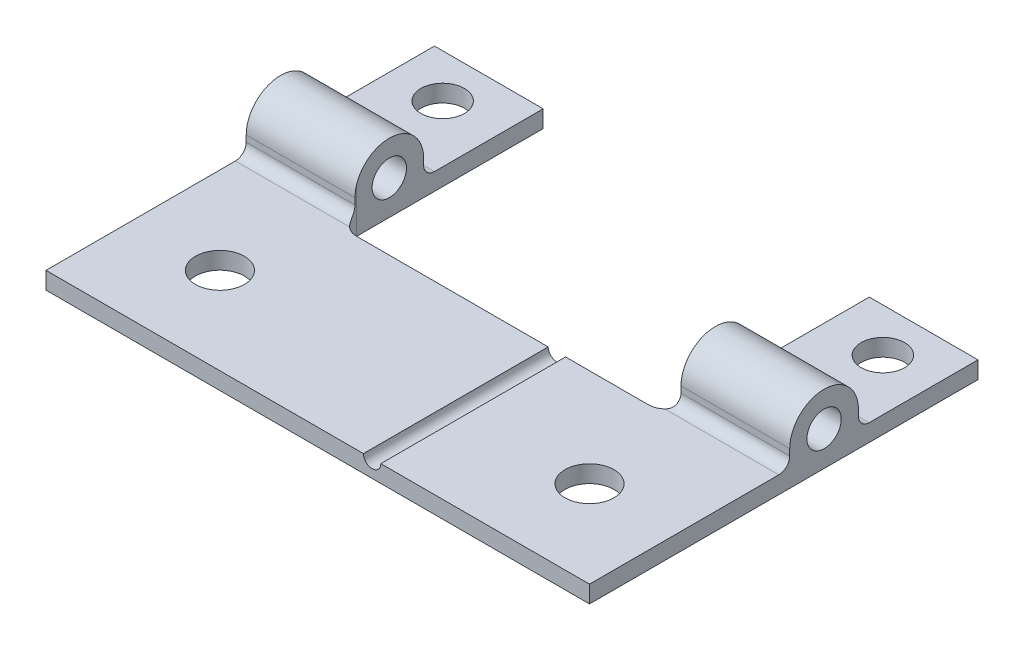
ISO-10303-21;
HEADER;
FILE_DESCRIPTION(('STEP AP214'),'2;1');
FILE_NAME('part.step','',(''),(''),'','','');
FILE_SCHEMA(('AUTOMOTIVE_DESIGN { 1 0 10303 214 1 1 1 1 }'));
ENDSEC;
DATA;
#1=APPLICATION_CONTEXT('core data for automotive mechanical design processes');
#2=APPLICATION_PROTOCOL_DEFINITION('international standard','automotive_design',2000,#1);
#3=PRODUCT_CONTEXT('',#1,'mechanical');
#4=PRODUCT('Part','Part','',(#3));
#5=PRODUCT_RELATED_PRODUCT_CATEGORY('part','',(#4));
#6=PRODUCT_DEFINITION_FORMATION('','',#4);
#7=PRODUCT_DEFINITION_CONTEXT('part definition',#1,'design');
#8=PRODUCT_DEFINITION('design','',#6,#7);
#9=PRODUCT_DEFINITION_SHAPE('','',#8);
#10=(LENGTH_UNIT() NAMED_UNIT(*) SI_UNIT(.MILLI.,.METRE.));
#11=(NAMED_UNIT(*) PLANE_ANGLE_UNIT() SI_UNIT($,.RADIAN.));
#12=(NAMED_UNIT(*) SI_UNIT($,.STERADIAN.) SOLID_ANGLE_UNIT());
#13=UNCERTAINTY_MEASURE_WITH_UNIT(LENGTH_MEASURE(1.E-05),#10,'distance_accuracy_value','');
#14=(GEOMETRIC_REPRESENTATION_CONTEXT(3) GLOBAL_UNCERTAINTY_ASSIGNED_CONTEXT((#13)) GLOBAL_UNIT_ASSIGNED_CONTEXT((#10,
#11,#12)) REPRESENTATION_CONTEXT('',''));
#15=CARTESIAN_POINT('',(0.,0.,0.));
#16=DIRECTION('',(0.,0.,1.));
#17=DIRECTION('',(1.,0.,0.));
#18=AXIS2_PLACEMENT_3D('',#15,#16,#17);
#19=CARTESIAN_POINT('',(0.,0.79,0.));
#20=DIRECTION('',(0.,-1.,0.));
#21=DIRECTION('',(0.,0.,-1.));
#22=AXIS2_PLACEMENT_3D('',#19,#20,#21);
#23=PLANE('',#22);
#24=CARTESIAN_POINT('',(9.8231981981982,0.79,-2.24887387387387));
#25=DIRECTION('',(0.,1.,0.));
#26=DIRECTION('',(0.,0.,1.));
#27=AXIS2_PLACEMENT_3D('',#24,#25,#26);
#28=CIRCLE('',#27,1.125);
#29=CARTESIAN_POINT('',(9.8231981981982,0.79,-1.12387387387387));
#30=VERTEX_POINT('',#29);
#31=EDGE_CURVE('E394',#30,#30,#28,.T.);
#32=ORIENTED_EDGE('',*,*,#31,.F.);
#33=EDGE_LOOP('',(#32));
#34=FACE_BOUND('',#33,.T.);
#35=DIRECTION('',(1.,0.,0.));
#36=VECTOR('',#35,1.);
#37=CARTESIAN_POINT('',(3.8231981981982,0.79,-6.74887387387387));
#38=LINE('',#37,#36);
#39=CARTESIAN_POINT('',(4.2231981981982,0.79,-6.74887387387387));
#40=VERTEX_POINT('',#39);
#41=CARTESIAN_POINT('',(8.03319819819819,0.79,-6.74887387387387));
#42=VERTEX_POINT('',#41);
#43=EDGE_CURVE('E396',#40,#42,#38,.T.);
#44=ORIENTED_EDGE('',*,*,#43,.F.);
#45=DIRECTION('',(0.,0.,1.));
#46=VECTOR('',#45,1.);
#47=CARTESIAN_POINT('',(4.2231981981982,0.79,-8.24887387387387));
#48=LINE('',#47,#46);
#49=CARTESIAN_POINT('',(4.2231981981982,0.79,1.75112612612613));
#50=VERTEX_POINT('',#49);
#51=EDGE_CURVE('E57',#40,#50,#48,.T.);
#52=ORIENTED_EDGE('',*,*,#51,.T.);
#53=DIRECTION('',(1.,0.,0.));
#54=VECTOR('',#53,1.);
#55=CARTESIAN_POINT('',(-11.1768018018018,0.79,1.75112612612613));
#56=LINE('',#55,#54);
#57=CARTESIAN_POINT('',(13.8231981981982,0.79,1.75112612612613));
#58=VERTEX_POINT('',#57);
#59=EDGE_CURVE('E220',#50,#58,#56,.T.);
#60=ORIENTED_EDGE('',*,*,#59,.T.);
#61=DIRECTION('',(0.,0.,-1.));
#62=VECTOR('',#61,1.);
#63=CARTESIAN_POINT('',(13.8231981981982,0.79,1.75112612612613));
#64=LINE('',#63,#62);
#65=CARTESIAN_POINT('',(13.8231981981982,0.79,-6.95887387387388));
#66=VERTEX_POINT('',#65);
#67=EDGE_CURVE('E228',#58,#66,#64,.T.);
#68=ORIENTED_EDGE('',*,*,#67,.T.);
#69=DIRECTION('',(1.,0.,0.));
#70=VECTOR('',#69,1.);
#71=CARTESIAN_POINT('',(0.,0.79,-6.95887387387387));
#72=LINE('',#71,#70);
#73=CARTESIAN_POINT('',(8.56957493147435,0.79,-6.95887387387388));
#74=VERTEX_POINT('',#73);
#75=EDGE_CURVE('E64',#66,#74,#72,.F.);
#76=ORIENTED_EDGE('',*,*,#75,.T.);
#77=CARTESIAN_POINT('',(8.03319819819819,0.79,-7.53887387387387));
#78=DIRECTION('',(0.,-1.,0.));
#79=DIRECTION('',(0.,0.,-1.));
#80=AXIS2_PLACEMENT_3D('',#77,#78,#79);
#81=CIRCLE('',#80,0.79);
#82=EDGE_CURVE('E50',#74,#42,#81,.T.);
#83=ORIENTED_EDGE('',*,*,#82,.T.);
#84=EDGE_LOOP('',(#44,#52,#60,#68,#76,#83));
#85=FACE_BOUND('',#84,.T.);
#86=ADVANCED_FACE('F40',(#34,#85),#23,.F.);
#87=CARTESIAN_POINT('',(-7.1768018018018,0.79,-2.24887387387387));
#88=DIRECTION('',(0.,1.,0.));
#89=DIRECTION('',(0.,0.,1.));
#90=AXIS2_PLACEMENT_3D('',#87,#88,#89);
#91=CIRCLE('',#90,1.125);
#92=CARTESIAN_POINT('',(-7.1768018018018,0.79,-1.12387387387387));
#93=VERTEX_POINT('',#92);
#94=EDGE_CURVE('E266',#93,#93,#91,.T.);
#95=ORIENTED_EDGE('',*,*,#94,.F.);
#96=EDGE_LOOP('',(#95));
#97=FACE_BOUND('',#96,.T.);
#98=CARTESIAN_POINT('',(-11.1768018018018,0.79,1.75112612612613));
#99=VERTEX_POINT('',#98);
#100=CARTESIAN_POINT('',(3.4231981981982,0.79,1.75112612612613));
#101=VERTEX_POINT('',#100);
#102=EDGE_CURVE('E217',#99,#101,#56,.T.);
#103=ORIENTED_EDGE('',*,*,#102,.T.);
#104=DIRECTION('',(0.,0.,1.));
#105=VECTOR('',#104,1.);
#106=CARTESIAN_POINT('',(3.4231981981982,0.79,-8.24887387387387));
#107=LINE('',#106,#105);
#108=CARTESIAN_POINT('',(3.4231981981982,0.79,-6.74887387387387));
#109=VERTEX_POINT('',#108);
#110=EDGE_CURVE('E202',#101,#109,#107,.F.);
#111=ORIENTED_EDGE('',*,*,#110,.T.);
#112=CARTESIAN_POINT('',(-5.3868018018018,0.79,-6.74887387387387));
#113=VERTEX_POINT('',#112);
#114=EDGE_CURVE('E401',#113,#109,#38,.T.);
#115=ORIENTED_EDGE('',*,*,#114,.F.);
#116=CARTESIAN_POINT('',(-5.3868018018018,0.79,-7.53887387387387));
#117=DIRECTION('',(0.,-1.,0.));
#118=DIRECTION('',(0.,0.,-1.));
#119=AXIS2_PLACEMENT_3D('',#116,#117,#118);
#120=CIRCLE('',#119,0.79);
#121=CARTESIAN_POINT('',(-5.92317853507796,0.79,-6.95887387387387));
#122=VERTEX_POINT('',#121);
#123=EDGE_CURVE('E307',#113,#122,#120,.T.);
#124=ORIENTED_EDGE('',*,*,#123,.T.);
#125=DIRECTION('',(-1.,0.,0.));
#126=VECTOR('',#125,1.);
#127=CARTESIAN_POINT('',(-11.1768018018018,0.79,-6.95887387387387));
#128=LINE('',#127,#126);
#129=CARTESIAN_POINT('',(-11.1768018018018,0.79,-6.95887387387387));
#130=VERTEX_POINT('',#129);
#131=EDGE_CURVE('E254',#122,#130,#128,.T.);
#132=ORIENTED_EDGE('',*,*,#131,.T.);
#133=DIRECTION('',(0.,0.,1.));
#134=VECTOR('',#133,1.);
#135=CARTESIAN_POINT('',(-11.1768018018018,0.79,1.75112612612613));
#136=LINE('',#135,#134);
#137=EDGE_CURVE('E226',#130,#99,#136,.T.);
#138=ORIENTED_EDGE('',*,*,#137,.T.);
#139=EDGE_LOOP('',(#103,#111,#115,#124,#132,#138));
#140=FACE_BOUND('',#139,.T.);
#141=ADVANCED_FACE('F223',(#97,#140),#23,.F.);
#142=CARTESIAN_POINT('',(-11.1768018018018,0.79,1.75112612612613));
#143=DIRECTION('',(1.,0.,0.));
#144=DIRECTION('',(0.,0.,-1.));
#145=AXIS2_PLACEMENT_3D('',#142,#143,#144);
#146=PLANE('',#145);
#147=CARTESIAN_POINT('',(-11.1768018018018,1.58,-9.03887387387387));
#148=DIRECTION('',(-1.,0.,0.));
#149=DIRECTION('',(0.,0.,1.));
#150=AXIS2_PLACEMENT_3D('',#147,#148,#149);
#151=CIRCLE('',#150,0.789999999999999);
#152=CARTESIAN_POINT('',(-11.1768018018018,1.58,-8.24887387387387));
#153=VERTEX_POINT('',#152);
#154=EDGE_CURVE('E260',#153,#153,#151,.T.);
#155=ORIENTED_EDGE('',*,*,#154,.F.);
#156=EDGE_LOOP('',(#155));
#157=FACE_BOUND('',#156,.T.);
#158=DIRECTION('',(0.,-1.,0.));
#159=VECTOR('',#158,1.);
#160=CARTESIAN_POINT('',(-11.1768018018018,0.,-16.1188738738739));
#161=LINE('',#160,#159);
#162=CARTESIAN_POINT('',(-11.1768018018018,0.790000000000035,-16.1188738738739));
#163=VERTEX_POINT('',#162);
#164=CARTESIAN_POINT('',(-11.1768018018018,0.,-16.1188738738739));
#165=VERTEX_POINT('',#164);
#166=EDGE_CURVE('E530',#163,#165,#161,.T.);
#167=ORIENTED_EDGE('',*,*,#166,.T.);
#168=DIRECTION('',(0.,0.,1.));
#169=VECTOR('',#168,1.);
#170=CARTESIAN_POINT('',(-11.1768018018018,0.,1.75112612612613));
#171=LINE('',#170,#169);
#172=CARTESIAN_POINT('',(-11.1768018018018,0.,1.75112612612613));
#173=VERTEX_POINT('',#172);
#174=EDGE_CURVE('E237',#165,#173,#171,.T.);
#175=ORIENTED_EDGE('',*,*,#174,.T.);
#176=DIRECTION('',(0.,-1.,0.));
#177=VECTOR('',#176,1.);
#178=CARTESIAN_POINT('',(-11.1768018018018,0.79,1.75112612612613));
#179=LINE('',#178,#177);
#180=EDGE_CURVE('E251',#99,#173,#179,.T.);
#181=ORIENTED_EDGE('',*,*,#180,.F.);
#182=ORIENTED_EDGE('',*,*,#137,.F.);
#183=CARTESIAN_POINT('',(-11.1768018018018,1.29,-6.95887387387387));
#184=DIRECTION('',(1.,0.,0.));
#185=DIRECTION('',(0.,0.,-1.));
#186=AXIS2_PLACEMENT_3D('',#183,#184,#185);
#187=CIRCLE('',#186,0.5);
#188=CARTESIAN_POINT('',(-11.1768018018018,1.29,-7.45887387387387));
#189=VERTEX_POINT('',#188);
#190=EDGE_CURVE('E275',#130,#189,#187,.T.);
#191=ORIENTED_EDGE('',*,*,#190,.T.);
#192=DIRECTION('',(0.,-1.,0.));
#193=VECTOR('',#192,1.);
#194=CARTESIAN_POINT('',(-11.1768018018018,0.,-7.45887387387387));
#195=LINE('',#194,#193);
#196=CARTESIAN_POINT('',(-11.1768018018018,1.58,-7.45887387387387));
#197=VERTEX_POINT('',#196);
#198=EDGE_CURVE('E534',#197,#189,#195,.T.);
#199=ORIENTED_EDGE('',*,*,#198,.F.);
#200=CARTESIAN_POINT('',(-11.1768018018018,1.58,-9.03887387387387));
#201=DIRECTION('',(-1.,0.,0.));
#202=DIRECTION('',(0.,0.,1.));
#203=AXIS2_PLACEMENT_3D('',#200,#201,#202);
#204=CIRCLE('',#203,1.58);
#205=CARTESIAN_POINT('',(-11.1768018018018,1.57999999999999,-10.6188738738739));
#206=VERTEX_POINT('',#205);
#207=EDGE_CURVE('E538',#197,#206,#204,.T.);
#208=ORIENTED_EDGE('',*,*,#207,.T.);
#209=DIRECTION('',(0.,-1.,0.));
#210=VECTOR('',#209,1.);
#211=CARTESIAN_POINT('',(-11.1768018018018,0.,-10.6188738738739));
#212=LINE('',#211,#210);
#213=CARTESIAN_POINT('',(-11.1768018018018,1.29,-10.6188738738739));
#214=VERTEX_POINT('',#213);
#215=EDGE_CURVE('E504',#206,#214,#212,.T.);
#216=ORIENTED_EDGE('',*,*,#215,.T.);
#217=CARTESIAN_POINT('',(-11.1768018018018,1.29,-11.1188738738739));
#218=DIRECTION('',(-1.,0.,0.));
#219=DIRECTION('',(0.,0.,1.));
#220=AXIS2_PLACEMENT_3D('',#217,#218,#219);
#221=CIRCLE('',#220,0.499999999999997);
#222=CARTESIAN_POINT('',(-11.1768018018018,0.790000000000003,-11.1188738738739));
#223=VERTEX_POINT('',#222);
#224=EDGE_CURVE('E259',#223,#214,#221,.T.);
#225=ORIENTED_EDGE('',*,*,#224,.F.);
#226=DIRECTION('',(0.,0.,-1.));
#227=VECTOR('',#226,1.);
#228=CARTESIAN_POINT('',(-11.1768018018018,0.789999999999932,0.));
#229=LINE('',#228,#227);
#230=EDGE_CURVE('E526',#223,#163,#229,.T.);
#231=ORIENTED_EDGE('',*,*,#230,.T.);
#232=EDGE_LOOP('',(#167,#175,#181,#182,#191,#199,#208,#216,#225,#231));
#233=FACE_BOUND('',#232,.T.);
#234=ADVANCED_FACE('F372',(#157,#233),#146,.F.);
#235=CARTESIAN_POINT('',(-11.1768018018018,0.79,1.75112612612613));
#236=DIRECTION('',(0.,0.,-1.));
#237=DIRECTION('',(-1.,0.,0.));
#238=AXIS2_PLACEMENT_3D('',#235,#236,#237);
#239=PLANE('',#238);
#240=ORIENTED_EDGE('',*,*,#59,.F.);
#241=CARTESIAN_POINT('',(3.8231981981982,0.79,1.75112612612613));
#242=DIRECTION('',(0.,0.,-1.));
#243=DIRECTION('',(-1.,0.,0.));
#244=AXIS2_PLACEMENT_3D('',#241,#242,#243);
#245=CIRCLE('',#244,0.4);
#246=EDGE_CURVE('E205',#101,#50,#245,.F.);
#247=ORIENTED_EDGE('',*,*,#246,.F.);
#248=ORIENTED_EDGE('',*,*,#102,.F.);
#249=ORIENTED_EDGE('',*,*,#180,.T.);
#250=DIRECTION('',(1.,0.,0.));
#251=VECTOR('',#250,1.);
#252=CARTESIAN_POINT('',(-11.1768018018018,0.,1.75112612612613));
#253=LINE('',#252,#251);
#254=CARTESIAN_POINT('',(13.8231981981982,0.,1.75112612612613));
#255=VERTEX_POINT('',#254);
#256=EDGE_CURVE('E241',#173,#255,#253,.T.);
#257=ORIENTED_EDGE('',*,*,#256,.T.);
#258=DIRECTION('',(0.,-1.,0.));
#259=VECTOR('',#258,1.);
#260=CARTESIAN_POINT('',(13.8231981981982,0.79,1.75112612612613));
#261=LINE('',#260,#259);
#262=EDGE_CURVE('E232',#58,#255,#261,.T.);
#263=ORIENTED_EDGE('',*,*,#262,.F.);
#264=EDGE_LOOP('',(#240,#247,#248,#249,#257,#263));
#265=FACE_BOUND('',#264,.T.);
#266=ADVANCED_FACE('F215',(#265),#239,.F.);
#267=CARTESIAN_POINT('',(13.8231981981982,0.79,1.75112612612613));
#268=DIRECTION('',(-1.,0.,0.));
#269=DIRECTION('',(0.,0.,1.));
#270=AXIS2_PLACEMENT_3D('',#267,#268,#269);
#271=PLANE('',#270);
#272=CARTESIAN_POINT('',(13.8231981981982,1.58,-9.03887387387388));
#273=DIRECTION('',(-1.,0.,0.));
#274=DIRECTION('',(0.,0.,1.));
#275=AXIS2_PLACEMENT_3D('',#272,#273,#274);
#276=CIRCLE('',#275,0.789999999999999);
#277=CARTESIAN_POINT('',(13.8231981981982,1.58,-8.24887387387388));
#278=VERTEX_POINT('',#277);
#279=EDGE_CURVE('E284',#278,#278,#276,.T.);
#280=ORIENTED_EDGE('',*,*,#279,.T.);
#281=EDGE_LOOP('',(#280));
#282=FACE_BOUND('',#281,.T.);
#283=DIRECTION('',(0.,0.,-1.));
#284=VECTOR('',#283,1.);
#285=CARTESIAN_POINT('',(13.8231981981982,0.,1.75112612612613));
#286=LINE('',#285,#284);
#287=CARTESIAN_POINT('',(13.8231981981982,0.,-16.1188738738739));
#288=VERTEX_POINT('',#287);
#289=EDGE_CURVE('E245',#255,#288,#286,.T.);
#290=ORIENTED_EDGE('',*,*,#289,.T.);
#291=DIRECTION('',(0.,-1.,0.));
#292=VECTOR('',#291,1.);
#293=CARTESIAN_POINT('',(13.8231981981982,0.,-16.1188738738739));
#294=LINE('',#293,#292);
#295=CARTESIAN_POINT('',(13.8231981981982,0.790000000000035,-16.1188738738739));
#296=VERTEX_POINT('',#295);
#297=EDGE_CURVE('E458',#296,#288,#294,.T.);
#298=ORIENTED_EDGE('',*,*,#297,.F.);
#299=DIRECTION('',(0.,0.,-1.));
#300=VECTOR('',#299,1.);
#301=CARTESIAN_POINT('',(13.8231981981982,0.789999999999932,0.));
#302=LINE('',#301,#300);
#303=CARTESIAN_POINT('',(13.8231981981982,0.790000000000003,-11.1188738738739));
#304=VERTEX_POINT('',#303);
#305=EDGE_CURVE('E427',#304,#296,#302,.T.);
#306=ORIENTED_EDGE('',*,*,#305,.F.);
#307=CARTESIAN_POINT('',(13.8231981981982,1.29,-11.1188738738739));
#308=DIRECTION('',(-1.,0.,0.));
#309=DIRECTION('',(0.,0.,1.));
#310=AXIS2_PLACEMENT_3D('',#307,#308,#309);
#311=CIRCLE('',#310,0.499999999999997);
#312=CARTESIAN_POINT('',(13.8231981981982,1.29,-10.6188738738739));
#313=VERTEX_POINT('',#312);
#314=EDGE_CURVE('E283',#304,#313,#311,.T.);
#315=ORIENTED_EDGE('',*,*,#314,.T.);
#316=DIRECTION('',(0.,-1.,0.));
#317=VECTOR('',#316,1.);
#318=CARTESIAN_POINT('',(13.8231981981982,0.,-10.6188738738739));
#319=LINE('',#318,#317);
#320=CARTESIAN_POINT('',(13.8231981981982,1.57999999999999,-10.6188738738739));
#321=VERTEX_POINT('',#320);
#322=EDGE_CURVE('E447',#321,#313,#319,.T.);
#323=ORIENTED_EDGE('',*,*,#322,.F.);
#324=CARTESIAN_POINT('',(13.8231981981982,1.58,-9.03887387387388));
#325=DIRECTION('',(-1.,0.,0.));
#326=DIRECTION('',(0.,0.,1.));
#327=AXIS2_PLACEMENT_3D('',#324,#325,#326);
#328=CIRCLE('',#327,1.58);
#329=CARTESIAN_POINT('',(13.8231981981982,1.58,-7.45887387387388));
#330=VERTEX_POINT('',#329);
#331=EDGE_CURVE('E451',#330,#321,#328,.T.);
#332=ORIENTED_EDGE('',*,*,#331,.F.);
#333=DIRECTION('',(0.,-1.,0.));
#334=VECTOR('',#333,1.);
#335=CARTESIAN_POINT('',(13.8231981981982,0.,-7.45887387387388));
#336=LINE('',#335,#334);
#337=CARTESIAN_POINT('',(13.8231981981982,1.29,-7.45887387387388));
#338=VERTEX_POINT('',#337);
#339=EDGE_CURVE('E454',#330,#338,#336,.T.);
#340=ORIENTED_EDGE('',*,*,#339,.T.);
#341=CARTESIAN_POINT('',(13.8231981981982,1.29,-6.95887387387388));
#342=DIRECTION('',(-1.,0.,0.));
#343=DIRECTION('',(0.,0.,1.));
#344=AXIS2_PLACEMENT_3D('',#341,#342,#343);
#345=CIRCLE('',#344,0.5);
#346=EDGE_CURVE('E290',#338,#66,#345,.T.);
#347=ORIENTED_EDGE('',*,*,#346,.T.);
#348=ORIENTED_EDGE('',*,*,#67,.F.);
#349=ORIENTED_EDGE('',*,*,#262,.T.);
#350=EDGE_LOOP('',(#290,#298,#306,#315,#323,#332,#340,#347,#348,#349));
#351=FACE_BOUND('',#350,.T.);
#352=ADVANCED_FACE('F376',(#282,#351),#271,.F.);
#353=CARTESIAN_POINT('',(0.,0.,0.));
#354=DIRECTION('',(0.,-1.,0.));
#355=DIRECTION('',(0.,0.,-1.));
#356=AXIS2_PLACEMENT_3D('',#353,#354,#355);
#357=PLANE('',#356);
#358=DIRECTION('',(0.,0.,-1.));
#359=VECTOR('',#358,1.);
#360=CARTESIAN_POINT('',(-6.1768018018018,0.,0.));
#361=LINE('',#360,#359);
#362=CARTESIAN_POINT('',(-6.1768018018018,0.,-7.53887387387387));
#363=VERTEX_POINT('',#362);
#364=CARTESIAN_POINT('',(-6.1768018018018,0.,-16.1188738738739));
#365=VERTEX_POINT('',#364);
#366=EDGE_CURVE('E512',#363,#365,#361,.T.);
#367=ORIENTED_EDGE('',*,*,#366,.F.);
#368=CARTESIAN_POINT('',(-5.3868018018018,0.,-7.53887387387387));
#369=DIRECTION('',(0.,-1.,0.));
#370=DIRECTION('',(0.,0.,-1.));
#371=AXIS2_PLACEMENT_3D('',#368,#369,#370);
#372=CIRCLE('',#371,0.79);
#373=CARTESIAN_POINT('',(-5.3868018018018,0.,-6.74887387387387));
#374=VERTEX_POINT('',#373);
#375=EDGE_CURVE('E342',#363,#374,#372,.F.);
#376=ORIENTED_EDGE('',*,*,#375,.T.);
#377=DIRECTION('',(-1.,0.,0.));
#378=VECTOR('',#377,1.);
#379=CARTESIAN_POINT('',(3.8231981981982,0.,-6.74887387387387));
#380=LINE('',#379,#378);
#381=CARTESIAN_POINT('',(8.03319819819819,0.,-6.74887387387387));
#382=VERTEX_POINT('',#381);
#383=EDGE_CURVE('E405',#382,#374,#380,.T.);
#384=ORIENTED_EDGE('',*,*,#383,.F.);
#385=CARTESIAN_POINT('',(8.03319819819819,0.,-7.53887387387387));
#386=DIRECTION('',(0.,-1.,0.));
#387=DIRECTION('',(0.,0.,-1.));
#388=AXIS2_PLACEMENT_3D('',#385,#386,#387);
#389=CIRCLE('',#388,0.79);
#390=CARTESIAN_POINT('',(8.8231981981982,0.,-7.53887387387387));
#391=VERTEX_POINT('',#390);
#392=EDGE_CURVE('E602',#382,#391,#389,.F.);
#393=ORIENTED_EDGE('',*,*,#392,.T.);
#394=DIRECTION('',(0.,0.,-1.));
#395=VECTOR('',#394,1.);
#396=CARTESIAN_POINT('',(8.8231981981982,0.,0.));
#397=LINE('',#396,#395);
#398=CARTESIAN_POINT('',(8.82319819819819,0.,-16.1188738738739));
#399=VERTEX_POINT('',#398);
#400=EDGE_CURVE('E433',#391,#399,#397,.T.);
#401=ORIENTED_EDGE('',*,*,#400,.T.);
#402=DIRECTION('',(1.,0.,0.));
#403=VECTOR('',#402,1.);
#404=CARTESIAN_POINT('',(8.82319819819819,0.,-16.1188738738739));
#405=LINE('',#404,#403);
#406=EDGE_CURVE('E472',#399,#288,#405,.T.);
#407=ORIENTED_EDGE('',*,*,#406,.T.);
#408=ORIENTED_EDGE('',*,*,#289,.F.);
#409=ORIENTED_EDGE('',*,*,#256,.F.);
#410=ORIENTED_EDGE('',*,*,#174,.F.);
#411=DIRECTION('',(-1.,0.,0.));
#412=VECTOR('',#411,1.);
#413=CARTESIAN_POINT('',(-6.1768018018018,0.,-16.1188738738739));
#414=LINE('',#413,#412);
#415=EDGE_CURVE('E553',#365,#165,#414,.T.);
#416=ORIENTED_EDGE('',*,*,#415,.F.);
#417=EDGE_LOOP('',(#367,#376,#384,#393,#401,#407,#408,#409,#410,#416));
#418=FACE_BOUND('',#417,.T.);
#419=CARTESIAN_POINT('',(11.4481981981982,0.,-14.1188738738739));
#420=DIRECTION('',(0.,-1.,0.));
#421=DIRECTION('',(0.,0.,-1.));
#422=AXIS2_PLACEMENT_3D('',#419,#420,#421);
#423=CIRCLE('',#422,1.);
#424=CARTESIAN_POINT('',(11.4481981981982,0.,-15.1188738738739));
#425=VERTEX_POINT('',#424);
#426=EDGE_CURVE('E415',#425,#425,#423,.F.);
#427=ORIENTED_EDGE('',*,*,#426,.T.);
#428=EDGE_LOOP('',(#427));
#429=FACE_BOUND('',#428,.T.);
#430=CARTESIAN_POINT('',(-8.8018018018018,0.,-14.1188738738739));
#431=DIRECTION('',(0.,-1.,0.));
#432=DIRECTION('',(0.,0.,-1.));
#433=AXIS2_PLACEMENT_3D('',#430,#431,#432);
#434=CIRCLE('',#433,1.);
#435=CARTESIAN_POINT('',(-8.8018018018018,0.,-15.1188738738739));
#436=VERTEX_POINT('',#435);
#437=EDGE_CURVE('E488',#436,#436,#434,.T.);
#438=ORIENTED_EDGE('',*,*,#437,.F.);
#439=EDGE_LOOP('',(#438));
#440=FACE_BOUND('',#439,.T.);
#441=CARTESIAN_POINT('',(-7.1768018018018,0.,-2.24887387387387));
#442=DIRECTION('',(0.,-1.,0.));
#443=DIRECTION('',(0.,0.,-1.));
#444=AXIS2_PLACEMENT_3D('',#441,#442,#443);
#445=CIRCLE('',#444,1.125);
#446=CARTESIAN_POINT('',(-7.1768018018018,0.,-3.37387387387387));
#447=VERTEX_POINT('',#446);
#448=EDGE_CURVE('E265',#447,#447,#445,.T.);
#449=ORIENTED_EDGE('',*,*,#448,.F.);
#450=EDGE_LOOP('',(#449));
#451=FACE_BOUND('',#450,.T.);
#452=CARTESIAN_POINT('',(9.8231981981982,0.,-2.24887387387387));
#453=DIRECTION('',(0.,-1.,0.));
#454=DIRECTION('',(0.,0.,-1.));
#455=AXIS2_PLACEMENT_3D('',#452,#453,#454);
#456=CIRCLE('',#455,1.125);
#457=CARTESIAN_POINT('',(9.8231981981982,0.,-3.37387387387387));
#458=VERTEX_POINT('',#457);
#459=EDGE_CURVE('E261',#458,#458,#456,.T.);
#460=ORIENTED_EDGE('',*,*,#459,.F.);
#461=EDGE_LOOP('',(#460));
#462=FACE_BOUND('',#461,.T.);
#463=ADVANCED_FACE('F368',(#418,#429,#440,#451,#462),#357,.T.);
#464=CARTESIAN_POINT('',(-6.1768018018018,1.29,-11.1188738738739));
#465=DIRECTION('',(-1.,0.,0.));
#466=DIRECTION('',(0.,0.,1.));
#467=AXIS2_PLACEMENT_3D('',#464,#465,#466);
#468=CYLINDRICAL_SURFACE('',#467,0.499999999999997);
#469=ORIENTED_EDGE('',*,*,#224,.T.);
#470=DIRECTION('',(-1.,0.,0.));
#471=VECTOR('',#470,1.);
#472=CARTESIAN_POINT('',(-6.1768018018018,1.29,-10.6188738738739));
#473=LINE('',#472,#471);
#474=CARTESIAN_POINT('',(-6.1768018018018,1.29,-10.6188738738739));
#475=VERTEX_POINT('',#474);
#476=EDGE_CURVE('E242',#475,#214,#473,.T.);
#477=ORIENTED_EDGE('',*,*,#476,.F.);
#478=CARTESIAN_POINT('',(-6.1768018018018,1.29,-11.1188738738739));
#479=DIRECTION('',(-1.,0.,0.));
#480=DIRECTION('',(0.,0.,1.));
#481=AXIS2_PLACEMENT_3D('',#478,#479,#480);
#482=CIRCLE('',#481,0.499999999999997);
#483=CARTESIAN_POINT('',(-6.1768018018018,0.790000000000003,-11.1188738738739));
#484=VERTEX_POINT('',#483);
#485=EDGE_CURVE('E500',#484,#475,#482,.T.);
#486=ORIENTED_EDGE('',*,*,#485,.F.);
#487=DIRECTION('',(-1.,0.,0.));
#488=VECTOR('',#487,1.);
#489=CARTESIAN_POINT('',(-6.1768018018018,0.790000000000003,-11.1188738738739));
#490=LINE('',#489,#488);
#491=EDGE_CURVE('E522',#484,#223,#490,.T.);
#492=ORIENTED_EDGE('',*,*,#491,.T.);
#493=EDGE_LOOP('',(#469,#477,#486,#492));
#494=FACE_BOUND('',#493,.T.);
#495=ADVANCED_FACE('F365',(#494),#468,.F.);
#496=CARTESIAN_POINT('',(-6.1768018018018,0.,-10.6188738738739));
#497=DIRECTION('',(0.,0.,-1.));
#498=DIRECTION('',(-1.,0.,0.));
#499=AXIS2_PLACEMENT_3D('',#496,#497,#498);
#500=PLANE('',#499);
#501=ORIENTED_EDGE('',*,*,#215,.F.);
#502=DIRECTION('',(-1.,0.,0.));
#503=VECTOR('',#502,1.);
#504=CARTESIAN_POINT('',(-6.1768018018018,1.57999999999999,-10.6188738738739));
#505=LINE('',#504,#503);
#506=CARTESIAN_POINT('',(-6.1768018018018,1.57999999999999,-10.6188738738739));
#507=VERTEX_POINT('',#506);
#508=EDGE_CURVE('E547',#507,#206,#505,.T.);
#509=ORIENTED_EDGE('',*,*,#508,.F.);
#510=DIRECTION('',(0.,-1.,0.));
#511=VECTOR('',#510,1.);
#512=CARTESIAN_POINT('',(-6.1768018018018,0.,-10.6188738738739));
#513=LINE('',#512,#511);
#514=EDGE_CURVE('E518',#507,#475,#513,.T.);
#515=ORIENTED_EDGE('',*,*,#514,.T.);
#516=ORIENTED_EDGE('',*,*,#476,.T.);
#517=EDGE_LOOP('',(#501,#509,#515,#516));
#518=FACE_BOUND('',#517,.T.);
#519=ADVANCED_FACE('F350',(#518),#500,.T.);
#520=CARTESIAN_POINT('',(-6.1768018018018,1.58,-9.03887387387387));
#521=DIRECTION('',(-1.,0.,0.));
#522=DIRECTION('',(0.,0.,1.));
#523=AXIS2_PLACEMENT_3D('',#520,#521,#522);
#524=CYLINDRICAL_SURFACE('',#523,1.58);
#525=ORIENTED_EDGE('',*,*,#207,.F.);
#526=DIRECTION('',(-1.,0.,0.));
#527=VECTOR('',#526,1.);
#528=CARTESIAN_POINT('',(-6.1768018018018,1.58,-7.45887387387387));
#529=LINE('',#528,#527);
#530=CARTESIAN_POINT('',(-6.17274073072695,1.58,-7.45887387387387));
#531=VERTEX_POINT('',#530);
#532=EDGE_CURVE('E550',#531,#197,#529,.T.);
#533=ORIENTED_EDGE('',*,*,#532,.F.);
#534=CARTESIAN_POINT('',(-6.17274073072695,1.58,-7.45887387387387));
#535=CARTESIAN_POINT('',(-6.17271873165551,1.6222150890217,-7.45887029628348));
#536=CARTESIAN_POINT('',(-6.17291303288011,1.66442830245246,-7.46056573279213));
#537=CARTESIAN_POINT('',(-6.17356595624928,1.74831507615736,-7.46730568527939));
#538=CARTESIAN_POINT('',(-6.1740228940677,1.78999036105862,-7.47232889083007));
#539=CARTESIAN_POINT('',(-6.17503673304547,1.87280716422653,-7.48567613537766));
#540=CARTESIAN_POINT('',(-6.17559363297583,1.91394868904886,-7.49400013379422));
#541=CARTESIAN_POINT('',(-6.17646775862404,1.99570263312272,-7.51395560135701));
#542=CARTESIAN_POINT('',(-6.17678342999501,2.03630999111318,-7.52560786651287));
#543=CARTESIAN_POINT('',(-6.1768018018018,2.07638694583963,-7.53887387387387));
#544=B_SPLINE_CURVE_WITH_KNOTS('',3,(#534,#535,#536,#537,#538,#539,#540,#541,#542,#543),
.UNSPECIFIED.,.F.,.F.,(4,2,2,2,4),(0.,0.126607774181664,0.252412512691905,0.378215704591545,
0.504822824397376),.UNSPECIFIED.);
#545=CARTESIAN_POINT('',(-6.1768018018018,2.07638694583963,-7.53887387387387));
#546=VERTEX_POINT('',#545);
#547=EDGE_CURVE('E334',#531,#546,#544,.T.);
#548=ORIENTED_EDGE('',*,*,#547,.T.);
#549=CARTESIAN_POINT('',(-6.1768018018018,1.58,-9.03887387387387));
#550=DIRECTION('',(-1.,0.,0.));
#551=DIRECTION('',(0.,0.,1.));
#552=AXIS2_PLACEMENT_3D('',#549,#550,#551);
#553=CIRCLE('',#552,1.58);
#554=EDGE_CURVE('E515',#546,#507,#553,.T.);
#555=ORIENTED_EDGE('',*,*,#554,.T.);
#556=ORIENTED_EDGE('',*,*,#508,.T.);
#557=EDGE_LOOP('',(#525,#533,#548,#555,#556));
#558=FACE_BOUND('',#557,.T.);
#559=ADVANCED_FACE('F344',(#558),#524,.T.);
#560=CARTESIAN_POINT('',(-6.1768018018018,0.,-7.45887387387387));
#561=DIRECTION('',(0.,0.,-1.));
#562=DIRECTION('',(0.,1.,0.));
#563=AXIS2_PLACEMENT_3D('',#560,#561,#562);
#564=PLANE('',#563);
#565=ORIENTED_EDGE('',*,*,#198,.T.);
#566=DIRECTION('',(-1.,0.,0.));
#567=VECTOR('',#566,1.);
#568=CARTESIAN_POINT('',(-6.1768018018018,1.29,-7.45887387387387));
#569=LINE('',#568,#567);
#570=CARTESIAN_POINT('',(-6.17274073072695,1.29,-7.45887387387387));
#571=VERTEX_POINT('',#570);
#572=EDGE_CURVE('E272',#189,#571,#569,.F.);
#573=ORIENTED_EDGE('',*,*,#572,.T.);
#574=DIRECTION('',(0.,-1.,0.));
#575=VECTOR('',#574,1.);
#576=CARTESIAN_POINT('',(-6.17274073072695,1.29,-7.45887387387387));
#577=LINE('',#576,#575);
#578=EDGE_CURVE('E320',#571,#531,#577,.F.);
#579=ORIENTED_EDGE('',*,*,#578,.T.);
#580=ORIENTED_EDGE('',*,*,#532,.T.);
#581=EDGE_LOOP('',(#565,#573,#579,#580));
#582=FACE_BOUND('',#581,.T.);
#583=ADVANCED_FACE('F349',(#582),#564,.F.);
#584=CARTESIAN_POINT('',(-6.1768018018018,0.,-16.1188738738739));
#585=DIRECTION('',(0.,0.,-1.));
#586=DIRECTION('',(-1.,0.,0.));
#587=AXIS2_PLACEMENT_3D('',#584,#585,#586);
#588=PLANE('',#587);
#589=ORIENTED_EDGE('',*,*,#166,.F.);
#590=DIRECTION('',(-1.,0.,0.));
#591=VECTOR('',#590,1.);
#592=CARTESIAN_POINT('',(-6.1768018018018,0.790000000000035,-16.1188738738739));
#593=LINE('',#592,#591);
#594=CARTESIAN_POINT('',(-6.1768018018018,0.790000000000035,-16.1188738738739));
#595=VERTEX_POINT('',#594);
#596=EDGE_CURVE('E557',#595,#163,#593,.T.);
#597=ORIENTED_EDGE('',*,*,#596,.F.);
#598=DIRECTION('',(0.,-1.,0.));
#599=VECTOR('',#598,1.);
#600=CARTESIAN_POINT('',(-6.1768018018018,0.,-16.1188738738739));
#601=LINE('',#600,#599);
#602=EDGE_CURVE('E508',#595,#365,#601,.T.);
#603=ORIENTED_EDGE('',*,*,#602,.T.);
#604=ORIENTED_EDGE('',*,*,#415,.T.);
#605=EDGE_LOOP('',(#589,#597,#603,#604));
#606=FACE_BOUND('',#605,.T.);
#607=ADVANCED_FACE('F355',(#606),#588,.T.);
#608=CARTESIAN_POINT('',(-6.1768018018018,0.789999999999932,0.));
#609=DIRECTION('',(0.,1.,0.));
#610=DIRECTION('',(0.,0.,1.));
#611=AXIS2_PLACEMENT_3D('',#608,#609,#610);
#612=PLANE('',#611);
#613=CARTESIAN_POINT('',(-8.8018018018018,0.790000000000022,-14.1188738738739));
#614=DIRECTION('',(0.,1.,0.));
#615=DIRECTION('',(0.,0.,1.));
#616=AXIS2_PLACEMENT_3D('',#613,#614,#615);
#617=CIRCLE('',#616,1.);
#618=CARTESIAN_POINT('',(-8.8018018018018,0.790000000000016,-13.1188738738739));
#619=VERTEX_POINT('',#618);
#620=EDGE_CURVE('E467',#619,#619,#617,.T.);
#621=ORIENTED_EDGE('',*,*,#620,.F.);
#622=EDGE_LOOP('',(#621));
#623=FACE_BOUND('',#622,.T.);
#624=ORIENTED_EDGE('',*,*,#230,.F.);
#625=ORIENTED_EDGE('',*,*,#491,.F.);
#626=DIRECTION('',(0.,0.,-1.));
#627=VECTOR('',#626,1.);
#628=CARTESIAN_POINT('',(-6.1768018018018,0.789999999999932,0.));
#629=LINE('',#628,#627);
#630=EDGE_CURVE('E503',#484,#595,#629,.T.);
#631=ORIENTED_EDGE('',*,*,#630,.T.);
#632=ORIENTED_EDGE('',*,*,#596,.T.);
#633=EDGE_LOOP('',(#624,#625,#631,#632));
#634=FACE_BOUND('',#633,.T.);
#635=ADVANCED_FACE('F359',(#623,#634),#612,.T.);
#636=CARTESIAN_POINT('',(-6.1768018018018,0.,0.));
#637=DIRECTION('',(-1.,0.,0.));
#638=DIRECTION('',(0.,0.,1.));
#639=AXIS2_PLACEMENT_3D('',#636,#637,#638);
#640=PLANE('',#639);
#641=CARTESIAN_POINT('',(-6.1768018018018,1.58,-9.03887387387387));
#642=DIRECTION('',(-1.,0.,0.));
#643=DIRECTION('',(0.,0.,1.));
#644=AXIS2_PLACEMENT_3D('',#641,#642,#643);
#645=CIRCLE('',#644,0.789999999999999);
#646=CARTESIAN_POINT('',(-6.1768018018018,1.58,-8.24887387387387));
#647=VERTEX_POINT('',#646);
#648=EDGE_CURVE('E255',#647,#647,#645,.T.);
#649=ORIENTED_EDGE('',*,*,#648,.T.);
#650=EDGE_LOOP('',(#649));
#651=FACE_BOUND('',#650,.T.);
#652=ORIENTED_EDGE('',*,*,#554,.F.);
#653=DIRECTION('',(0.,1.,0.));
#654=VECTOR('',#653,1.);
#655=CARTESIAN_POINT('',(-6.1768018018018,0.,-7.53887387387387));
#656=LINE('',#655,#654);
#657=EDGE_CURVE('E301',#546,#363,#656,.F.);
#658=ORIENTED_EDGE('',*,*,#657,.T.);
#659=ORIENTED_EDGE('',*,*,#366,.T.);
#660=ORIENTED_EDGE('',*,*,#602,.F.);
#661=ORIENTED_EDGE('',*,*,#630,.F.);
#662=ORIENTED_EDGE('',*,*,#485,.T.);
#663=ORIENTED_EDGE('',*,*,#514,.F.);
#664=EDGE_LOOP('',(#652,#658,#659,#660,#661,#662,#663));
#665=FACE_BOUND('',#664,.T.);
#666=ADVANCED_FACE('F363',(#651,#665),#640,.F.);
#667=CARTESIAN_POINT('',(13.8231981981982,1.58,-9.03887387387387));
#668=DIRECTION('',(-1.,0.,0.));
#669=DIRECTION('',(0.,0.,1.));
#670=AXIS2_PLACEMENT_3D('',#667,#668,#669);
#671=CYLINDRICAL_SURFACE('',#670,0.789999999999999);
#672=ORIENTED_EDGE('',*,*,#154,.T.);
#673=EDGE_LOOP('',(#672));
#674=FACE_BOUND('',#673,.T.);
#675=ORIENTED_EDGE('',*,*,#648,.F.);
#676=EDGE_LOOP('',(#675));
#677=FACE_BOUND('',#676,.T.);
#678=ADVANCED_FACE('F632',(#674,#677),#671,.F.);
#679=CARTESIAN_POINT('',(9.8231981981982,-3.21,-2.24887387387387));
#680=DIRECTION('',(0.,1.,0.));
#681=DIRECTION('',(0.,0.,1.));
#682=AXIS2_PLACEMENT_3D('',#679,#680,#681);
#683=CYLINDRICAL_SURFACE('',#682,1.125);
#684=ORIENTED_EDGE('',*,*,#459,.T.);
#685=EDGE_LOOP('',(#684));
#686=FACE_BOUND('',#685,.T.);
#687=ORIENTED_EDGE('',*,*,#31,.T.);
#688=EDGE_LOOP('',(#687));
#689=FACE_BOUND('',#688,.T.);
#690=ADVANCED_FACE('F628',(#686,#689),#683,.F.);
#691=CARTESIAN_POINT('',(-7.1768018018018,-3.21,-2.24887387387387));
#692=DIRECTION('',(0.,1.,0.));
#693=DIRECTION('',(0.,0.,1.));
#694=AXIS2_PLACEMENT_3D('',#691,#692,#693);
#695=CYLINDRICAL_SURFACE('',#694,1.125);
#696=ORIENTED_EDGE('',*,*,#448,.T.);
#697=EDGE_LOOP('',(#696));
#698=FACE_BOUND('',#697,.T.);
#699=ORIENTED_EDGE('',*,*,#94,.T.);
#700=EDGE_LOOP('',(#699));
#701=FACE_BOUND('',#700,.T.);
#702=ADVANCED_FACE('F624',(#698,#701),#695,.F.);
#703=CARTESIAN_POINT('',(-8.8018018018018,-0.709999999999978,-14.1188738738739));
#704=DIRECTION('',(0.,1.,0.));
#705=DIRECTION('',(0.,0.,1.));
#706=AXIS2_PLACEMENT_3D('',#703,#704,#705);
#707=CYLINDRICAL_SURFACE('',#706,1.);
#708=ORIENTED_EDGE('',*,*,#437,.T.);
#709=EDGE_LOOP('',(#708));
#710=FACE_BOUND('',#709,.T.);
#711=ORIENTED_EDGE('',*,*,#620,.T.);
#712=EDGE_LOOP('',(#711));
#713=FACE_BOUND('',#712,.T.);
#714=ADVANCED_FACE('F621',(#710,#713),#707,.F.);
#715=CARTESIAN_POINT('',(0.,1.29,-6.95887387387387));
#716=DIRECTION('',(1.,0.,0.));
#717=DIRECTION('',(0.,0.,-1.));
#718=AXIS2_PLACEMENT_3D('',#715,#716,#717);
#719=CYLINDRICAL_SURFACE('',#718,0.5);
#720=ORIENTED_EDGE('',*,*,#131,.F.);
#721=CARTESIAN_POINT('',(-5.92317853507796,0.79,-6.95887387387387));
#722=CARTESIAN_POINT('',(-5.93422317278709,0.790001045174393,-6.96908724882208));
#723=CARTESIAN_POINT('',(-5.94497330110216,0.790313384360848,-6.97961545825928));
#724=CARTESIAN_POINT('',(-5.9658443085888,0.791680711097628,-7.00125294094057));
#725=CARTESIAN_POINT('',(-5.97596450232857,0.792736492727766,-7.0123628237214));
#726=CARTESIAN_POINT('',(-6.00537773389532,0.797212764398667,-7.04656572939109));
#727=CARTESIAN_POINT('',(-6.02361760117695,0.801944485967643,-7.07043397622895));
#728=CARTESIAN_POINT('',(-6.05689880004973,0.815784522150258,-7.11940669119704));
#729=CARTESIAN_POINT('',(-6.07191610605228,0.824924165893164,-7.14451883582656));
#730=CARTESIAN_POINT('',(-6.09826447746624,0.848061742600952,-7.19432921931868));
#731=CARTESIAN_POINT('',(-6.10960958189306,0.862040739619956,-7.21902868378242));
#732=CARTESIAN_POINT('',(-6.12750996823053,0.892567901931396,-7.26329308440495));
#733=CARTESIAN_POINT('',(-6.13450584548688,0.908511756151436,-7.28310037572902));
#734=CARTESIAN_POINT('',(-6.14624238645944,0.943649084376534,-7.32039525419308));
#735=CARTESIAN_POINT('',(-6.15098093477938,0.962845583768249,-7.33788065441241));
#736=CARTESIAN_POINT('',(-6.1585669190999,1.0033945735928,-7.36936016266471));
#737=CARTESIAN_POINT('',(-6.16146131151924,1.02467612105863,-7.38343477591013));
#738=CARTESIAN_POINT('',(-6.16602486408119,1.0692314963985,-7.40822040194232));
#739=CARTESIAN_POINT('',(-6.16769364251083,1.09250594243558,-7.41893036622777));
#740=CARTESIAN_POINT('',(-6.17040921520749,1.14415221425623,-7.43803576384486));
#741=CARTESIAN_POINT('',(-6.17132176635206,1.17275908061833,-7.44582628978182));
#742=CARTESIAN_POINT('',(-6.17219430900064,1.21634945619202,-7.45364178971177));
#743=CARTESIAN_POINT('',(-6.17240239907356,1.23100878874879,-7.45560192591773));
#744=CARTESIAN_POINT('',(-6.17267425969228,1.26044254382359,-7.45821767346522));
#745=CARTESIAN_POINT('',(-6.17273805203519,1.27521694862084,-7.45887348183212));
#746=CARTESIAN_POINT('',(-6.17274073072695,1.29,-7.45887387387387));
#747=B_SPLINE_CURVE_WITH_KNOTS('',3,(#721,#722,#723,#724,#725,#726,#727,#728,#729,#730,#731,
#732,#733,#734,#735,#736,#737,#738,#739,#740,#741,#742,#743,#744,#745,#746),.UNSPECIFIED.,.F.,
.F.,(4,2,2,2,2,2,2,2,2,2,2,2,4),(0.,0.0451122292666833,0.0902727166812824,0.181021777136078,
0.272425556801688,0.363475650514148,0.442195176069124,0.520988327134143,0.597685309326226,
0.67440616839341,0.762866342471107,0.807190262402029,0.85150748647035),.UNSPECIFIED.);
#748=EDGE_CURVE('E311',#122,#571,#747,.T.);
#749=ORIENTED_EDGE('',*,*,#748,.T.);
#750=ORIENTED_EDGE('',*,*,#572,.F.);
#751=ORIENTED_EDGE('',*,*,#190,.F.);
#752=EDGE_LOOP('',(#720,#749,#750,#751));
#753=FACE_BOUND('',#752,.T.);
#754=ADVANCED_FACE('F322',(#753),#719,.F.);
#755=CARTESIAN_POINT('',(8.8231981981982,1.29,-11.1188738738739));
#756=DIRECTION('',(1.,0.,0.));
#757=DIRECTION('',(0.,0.,-1.));
#758=AXIS2_PLACEMENT_3D('',#755,#756,#757);
#759=CYLINDRICAL_SURFACE('',#758,0.499999999999997);
#760=ORIENTED_EDGE('',*,*,#314,.F.);
#761=DIRECTION('',(1.,0.,0.));
#762=VECTOR('',#761,1.);
#763=CARTESIAN_POINT('',(8.8231981981982,0.790000000000003,-11.1188738738739));
#764=LINE('',#763,#762);
#765=CARTESIAN_POINT('',(8.8231981981982,0.790000000000003,-11.1188738738739));
#766=VERTEX_POINT('',#765);
#767=EDGE_CURVE('E464',#766,#304,#764,.T.);
#768=ORIENTED_EDGE('',*,*,#767,.F.);
#769=CARTESIAN_POINT('',(8.8231981981982,1.29,-11.1188738738739));
#770=DIRECTION('',(-1.,0.,0.));
#771=DIRECTION('',(0.,0.,1.));
#772=AXIS2_PLACEMENT_3D('',#769,#770,#771);
#773=CIRCLE('',#772,0.499999999999997);
#774=CARTESIAN_POINT('',(8.8231981981982,1.29,-10.6188738738739));
#775=VERTEX_POINT('',#774);
#776=EDGE_CURVE('E422',#766,#775,#773,.T.);
#777=ORIENTED_EDGE('',*,*,#776,.T.);
#778=DIRECTION('',(1.,0.,0.));
#779=VECTOR('',#778,1.);
#780=CARTESIAN_POINT('',(8.8231981981982,1.29,-10.6188738738739));
#781=LINE('',#780,#779);
#782=EDGE_CURVE('E443',#775,#313,#781,.T.);
#783=ORIENTED_EDGE('',*,*,#782,.T.);
#784=EDGE_LOOP('',(#760,#768,#777,#783));
#785=FACE_BOUND('',#784,.T.);
#786=ADVANCED_FACE('F616',(#785),#759,.F.);
#787=CARTESIAN_POINT('',(8.8231981981982,0.789999999999932,0.));
#788=DIRECTION('',(0.,-1.,0.));
#789=DIRECTION('',(0.,0.,-1.));
#790=AXIS2_PLACEMENT_3D('',#787,#788,#789);
#791=PLANE('',#790);
#792=CARTESIAN_POINT('',(11.4481981981982,0.790000000000022,-14.1188738738739));
#793=DIRECTION('',(0.,-1.,0.));
#794=DIRECTION('',(0.,0.,1.));
#795=AXIS2_PLACEMENT_3D('',#792,#793,#794);
#796=CIRCLE('',#795,1.);
#797=CARTESIAN_POINT('',(11.4481981981982,0.790000000000016,-13.1188738738739));
#798=VERTEX_POINT('',#797);
#799=EDGE_CURVE('E411',#798,#798,#796,.T.);
#800=ORIENTED_EDGE('',*,*,#799,.T.);
#801=EDGE_LOOP('',(#800));
#802=FACE_BOUND('',#801,.T.);
#803=ORIENTED_EDGE('',*,*,#305,.T.);
#804=DIRECTION('',(1.,0.,0.));
#805=VECTOR('',#804,1.);
#806=CARTESIAN_POINT('',(8.82319819819819,0.790000000000035,-16.1188738738739));
#807=LINE('',#806,#805);
#808=CARTESIAN_POINT('',(8.82319819819819,0.790000000000035,-16.1188738738739));
#809=VERTEX_POINT('',#808);
#810=EDGE_CURVE('E468',#809,#296,#807,.T.);
#811=ORIENTED_EDGE('',*,*,#810,.F.);
#812=DIRECTION('',(0.,0.,-1.));
#813=VECTOR('',#812,1.);
#814=CARTESIAN_POINT('',(8.8231981981982,0.789999999999932,0.));
#815=LINE('',#814,#813);
#816=EDGE_CURVE('E440',#766,#809,#815,.T.);
#817=ORIENTED_EDGE('',*,*,#816,.F.);
#818=ORIENTED_EDGE('',*,*,#767,.T.);
#819=EDGE_LOOP('',(#803,#811,#817,#818));
#820=FACE_BOUND('',#819,.T.);
#821=ADVANCED_FACE('F619',(#802,#820),#791,.F.);
#822=CARTESIAN_POINT('',(8.82319819819819,0.,-16.1188738738739));
#823=DIRECTION('',(0.,0.,1.));
#824=DIRECTION('',(1.,0.,0.));
#825=AXIS2_PLACEMENT_3D('',#822,#823,#824);
#826=PLANE('',#825);
#827=ORIENTED_EDGE('',*,*,#297,.T.);
#828=ORIENTED_EDGE('',*,*,#406,.F.);
#829=DIRECTION('',(0.,-1.,0.));
#830=VECTOR('',#829,1.);
#831=CARTESIAN_POINT('',(8.82319819819819,0.,-16.1188738738739));
#832=LINE('',#831,#830);
#833=EDGE_CURVE('E436',#809,#399,#832,.T.);
#834=ORIENTED_EDGE('',*,*,#833,.F.);
#835=ORIENTED_EDGE('',*,*,#810,.T.);
#836=EDGE_LOOP('',(#827,#828,#834,#835));
#837=FACE_BOUND('',#836,.T.);
#838=ADVANCED_FACE('F671',(#837),#826,.F.);
#839=CARTESIAN_POINT('',(8.8231981981982,0.,-7.45887387387388));
#840=DIRECTION('',(0.,0.,1.));
#841=DIRECTION('',(0.,-1.,0.));
#842=AXIS2_PLACEMENT_3D('',#839,#840,#841);
#843=PLANE('',#842);
#844=DIRECTION('',(1.,0.,0.));
#845=VECTOR('',#844,1.);
#846=CARTESIAN_POINT('',(8.8231981981982,1.58,-7.45887387387388));
#847=LINE('',#846,#845);
#848=CARTESIAN_POINT('',(8.81913712712334,1.58,-7.45887387387388));
#849=VERTEX_POINT('',#848);
#850=EDGE_CURVE('E476',#849,#330,#847,.T.);
#851=ORIENTED_EDGE('',*,*,#850,.F.);
#852=DIRECTION('',(0.,1.,0.));
#853=VECTOR('',#852,1.);
#854=CARTESIAN_POINT('',(8.81913712712334,1.58,-7.45887387387388));
#855=LINE('',#854,#853);
#856=CARTESIAN_POINT('',(8.81913712712334,1.29,-7.45887387387388));
#857=VERTEX_POINT('',#856);
#858=EDGE_CURVE('E583',#849,#857,#855,.F.);
#859=ORIENTED_EDGE('',*,*,#858,.T.);
#860=DIRECTION('',(1.,0.,0.));
#861=VECTOR('',#860,1.);
#862=CARTESIAN_POINT('',(8.8231981981982,1.29,-7.45887387387388));
#863=LINE('',#862,#861);
#864=EDGE_CURVE('E278',#857,#338,#863,.T.);
#865=ORIENTED_EDGE('',*,*,#864,.T.);
#866=ORIENTED_EDGE('',*,*,#339,.F.);
#867=EDGE_LOOP('',(#851,#859,#865,#866));
#868=FACE_BOUND('',#867,.T.);
#869=ADVANCED_FACE('F609',(#868),#843,.T.);
#870=CARTESIAN_POINT('',(8.8231981981982,1.58,-9.03887387387387));
#871=DIRECTION('',(1.,0.,0.));
#872=DIRECTION('',(0.,0.,-1.));
#873=AXIS2_PLACEMENT_3D('',#870,#871,#872);
#874=CYLINDRICAL_SURFACE('',#873,1.58);
#875=ORIENTED_EDGE('',*,*,#331,.T.);
#876=DIRECTION('',(1.,0.,0.));
#877=VECTOR('',#876,1.);
#878=CARTESIAN_POINT('',(8.8231981981982,1.57999999999999,-10.6188738738739));
#879=LINE('',#878,#877);
#880=CARTESIAN_POINT('',(8.8231981981982,1.57999999999999,-10.6188738738739));
#881=VERTEX_POINT('',#880);
#882=EDGE_CURVE('E479',#881,#321,#879,.T.);
#883=ORIENTED_EDGE('',*,*,#882,.F.);
#884=CARTESIAN_POINT('',(8.8231981981982,1.58,-9.03887387387387));
#885=DIRECTION('',(-1.,0.,0.));
#886=DIRECTION('',(0.,0.,1.));
#887=AXIS2_PLACEMENT_3D('',#884,#885,#886);
#888=CIRCLE('',#887,1.58);
#889=CARTESIAN_POINT('',(8.8231981981982,2.07638694583963,-7.53887387387387));
#890=VERTEX_POINT('',#889);
#891=EDGE_CURVE('E430',#890,#881,#888,.T.);
#892=ORIENTED_EDGE('',*,*,#891,.F.);
#893=CARTESIAN_POINT('',(8.8231981981982,2.07638694583963,-7.53887387387387));
#894=CARTESIAN_POINT('',(8.8231798263914,2.03630999111317,-7.52560786651287));
#895=CARTESIAN_POINT('',(8.82286415502043,1.99570263312272,-7.51395560135702));
#896=CARTESIAN_POINT('',(8.82199002937222,1.91394868904886,-7.49400013379422));
#897=CARTESIAN_POINT('',(8.82143312944186,1.87280716422653,-7.48567613537766));
#898=CARTESIAN_POINT('',(8.82041929046409,1.78999036105862,-7.47232889083007));
#899=CARTESIAN_POINT('',(8.81996235264567,1.74831507615735,-7.46730568527939));
#900=CARTESIAN_POINT('',(8.8193094292765,1.66442830245246,-7.46056573279213));
#901=CARTESIAN_POINT('',(8.8191151280519,1.6222150890217,-7.45887029628348));
#902=CARTESIAN_POINT('',(8.81913712712334,1.58,-7.45887387387388));
#903=B_SPLINE_CURVE_WITH_KNOTS('',3,(#893,#894,#895,#896,#897,#898,#899,#900,#901,#902),
.UNSPECIFIED.,.F.,.F.,(4,2,2,2,4),(0.,0.12660711980583,0.252410311705468,0.378215050215708,
0.50482282439737),.UNSPECIFIED.);
#904=EDGE_CURVE('E594',#890,#849,#903,.T.);
#905=ORIENTED_EDGE('',*,*,#904,.T.);
#906=ORIENTED_EDGE('',*,*,#850,.T.);
#907=EDGE_LOOP('',(#875,#883,#892,#905,#906));
#908=FACE_BOUND('',#907,.T.);
#909=ADVANCED_FACE('F603',(#908),#874,.T.);
#910=CARTESIAN_POINT('',(8.8231981981982,0.,-10.6188738738739));
#911=DIRECTION('',(0.,0.,1.));
#912=DIRECTION('',(1.,0.,0.));
#913=AXIS2_PLACEMENT_3D('',#910,#911,#912);
#914=PLANE('',#913);
#915=ORIENTED_EDGE('',*,*,#322,.T.);
#916=ORIENTED_EDGE('',*,*,#782,.F.);
#917=DIRECTION('',(0.,-1.,0.));
#918=VECTOR('',#917,1.);
#919=CARTESIAN_POINT('',(8.8231981981982,0.,-10.6188738738739));
#920=LINE('',#919,#918);
#921=EDGE_CURVE('E426',#881,#775,#920,.T.);
#922=ORIENTED_EDGE('',*,*,#921,.F.);
#923=ORIENTED_EDGE('',*,*,#882,.T.);
#924=EDGE_LOOP('',(#915,#916,#922,#923));
#925=FACE_BOUND('',#924,.T.);
#926=ADVANCED_FACE('F608',(#925),#914,.F.);
#927=CARTESIAN_POINT('',(8.8231981981982,0.,0.));
#928=DIRECTION('',(1.,0.,0.));
#929=DIRECTION('',(0.,0.,1.));
#930=AXIS2_PLACEMENT_3D('',#927,#928,#929);
#931=PLANE('',#930);
#932=CARTESIAN_POINT('',(8.82319819819819,1.58,-9.03887387387387));
#933=DIRECTION('',(1.,0.,0.));
#934=DIRECTION('',(0.,0.,-1.));
#935=AXIS2_PLACEMENT_3D('',#932,#933,#934);
#936=CIRCLE('',#935,0.789999999999999);
#937=CARTESIAN_POINT('',(8.82319819819819,1.58,-9.82887387387387));
#938=VERTEX_POINT('',#937);
#939=EDGE_CURVE('E279',#938,#938,#936,.F.);
#940=ORIENTED_EDGE('',*,*,#939,.F.);
#941=EDGE_LOOP('',(#940));
#942=FACE_BOUND('',#941,.T.);
#943=ORIENTED_EDGE('',*,*,#400,.F.);
#944=DIRECTION('',(0.,-1.,0.));
#945=VECTOR('',#944,1.);
#946=CARTESIAN_POINT('',(8.8231981981982,0.79,-7.53887387387387));
#947=LINE('',#946,#945);
#948=EDGE_CURVE('E304',#391,#890,#947,.F.);
#949=ORIENTED_EDGE('',*,*,#948,.T.);
#950=ORIENTED_EDGE('',*,*,#891,.T.);
#951=ORIENTED_EDGE('',*,*,#921,.T.);
#952=ORIENTED_EDGE('',*,*,#776,.F.);
#953=ORIENTED_EDGE('',*,*,#816,.T.);
#954=ORIENTED_EDGE('',*,*,#833,.T.);
#955=EDGE_LOOP('',(#943,#949,#950,#951,#952,#953,#954));
#956=FACE_BOUND('',#955,.T.);
#957=ADVANCED_FACE('F614',(#942,#956),#931,.F.);
#958=CARTESIAN_POINT('',(-11.1768018018018,1.58,-9.03887387387387));
#959=DIRECTION('',(1.,0.,0.));
#960=DIRECTION('',(0.,0.,-1.));
#961=AXIS2_PLACEMENT_3D('',#958,#959,#960);
#962=CYLINDRICAL_SURFACE('',#961,0.789999999999999);
#963=ORIENTED_EDGE('',*,*,#279,.F.);
#964=EDGE_LOOP('',(#963));
#965=FACE_BOUND('',#964,.T.);
#966=ORIENTED_EDGE('',*,*,#939,.T.);
#967=EDGE_LOOP('',(#966));
#968=FACE_BOUND('',#967,.T.);
#969=ADVANCED_FACE('F686',(#965,#968),#962,.F.);
#970=CARTESIAN_POINT('',(11.4481981981982,-0.709999999999978,-14.1188738738739));
#971=DIRECTION('',(0.,1.,0.));
#972=DIRECTION('',(0.,0.,1.));
#973=AXIS2_PLACEMENT_3D('',#970,#971,#972);
#974=CYLINDRICAL_SURFACE('',#973,1.);
#975=ORIENTED_EDGE('',*,*,#426,.F.);
#976=EDGE_LOOP('',(#975));
#977=FACE_BOUND('',#976,.T.);
#978=ORIENTED_EDGE('',*,*,#799,.F.);
#979=EDGE_LOOP('',(#978));
#980=FACE_BOUND('',#979,.T.);
#981=ADVANCED_FACE('F690',(#977,#980),#974,.F.);
#982=CARTESIAN_POINT('',(8.8231981981982,1.29,-6.95887387387388));
#983=DIRECTION('',(1.,0.,0.));
#984=DIRECTION('',(0.,0.,-1.));
#985=AXIS2_PLACEMENT_3D('',#982,#983,#984);
#986=CYLINDRICAL_SURFACE('',#985,0.5);
#987=ORIENTED_EDGE('',*,*,#864,.F.);
#988=CARTESIAN_POINT('',(8.81913712712334,1.29,-7.45887387387388));
#989=CARTESIAN_POINT('',(8.81909813720879,1.26229076836659,-7.45889883582426));
#990=CARTESIAN_POINT('',(8.81890194532858,1.23458356099371,-7.45657186247763));
#991=CARTESIAN_POINT('',(8.81790756862895,1.17992287988242,-7.44738675187063));
#992=CARTESIAN_POINT('',(8.81710898975585,1.15296991150668,-7.44052564895683));
#993=CARTESIAN_POINT('',(8.81462037446407,1.10058098027522,-7.42243688038859));
#994=CARTESIAN_POINT('',(8.81292949747657,1.07514647304141,-7.41120510006278));
#995=CARTESIAN_POINT('',(8.80813730961618,1.02659683602898,-7.38476274499886));
#996=CARTESIAN_POINT('',(8.8050369909674,1.00348008853486,-7.36955497248972));
#997=CARTESIAN_POINT('',(8.79692477802257,0.960749437195794,-7.33611859374325));
#998=CARTESIAN_POINT('',(8.79195653868713,0.941069538300033,-7.31796398614359));
#999=CARTESIAN_POINT('',(8.77958219794805,0.905191075123983,-7.27921478374845));
#1000=CARTESIAN_POINT('',(8.77217724046037,0.888990883183872,-7.25862133676294));
#1001=CARTESIAN_POINT('',(8.75506506209034,0.861207878764733,-7.21718714742502));
#1002=CARTESIAN_POINT('',(8.74550589324169,0.849421002868465,-7.19642151899326));
#1003=CARTESIAN_POINT('',(8.723822156407,0.829299517178844,-7.15456438521383));
#1004=CARTESIAN_POINT('',(8.71169708272682,0.820965588859029,-7.13347281638977));
#1005=CARTESIAN_POINT('',(8.68485623882956,0.807424447855406,-7.09158351090697));
#1006=CARTESIAN_POINT('',(8.67011136166281,0.802255615589601,-7.07079225579348));
#1007=CARTESIAN_POINT('',(8.63840293332271,0.794725545563265,-7.03046016363521));
#1008=CARTESIAN_POINT('',(8.62143973239537,0.792363865180649,-7.01091912991968));
#1009=CARTESIAN_POINT('',(8.59255386107822,0.790347594301091,-6.98077308726978));
#1010=CARTESIAN_POINT('',(8.58122391812611,0.789998757176548,-6.96963865997426));
#1011=CARTESIAN_POINT('',(8.56957493147435,0.789999999999999,-6.95887387387387));
#1012=B_SPLINE_CURVE_WITH_KNOTS('',3,(#988,#989,#990,#991,#992,#993,#994,#995,#996,#997,#998,
#999,#1000,#1001,#1002,#1003,#1004,#1005,#1006,#1007,#1008,#1009,#1010,#1011),.UNSPECIFIED.,.F.,
.F.,(4,2,2,2,2,2,2,2,2,2,2,4),(0.,0.083027705598133,0.166109771228955,0.249270242481422,
0.332372260548706,0.413641987243112,0.494873616208706,0.571662868796661,0.648467269296417,
0.726185465094979,0.803891404928626,0.851497777337193),.UNSPECIFIED.);
#1013=EDGE_CURVE('E578',#857,#74,#1012,.T.);
#1014=ORIENTED_EDGE('',*,*,#1013,.T.);
#1015=ORIENTED_EDGE('',*,*,#75,.F.);
#1016=ORIENTED_EDGE('',*,*,#346,.F.);
#1017=EDGE_LOOP('',(#987,#1014,#1015,#1016));
#1018=FACE_BOUND('',#1017,.T.);
#1019=ADVANCED_FACE('F331',(#1018),#986,.F.);
#1020=CARTESIAN_POINT('',(0.,0.,-6.74887387387387));
#1021=DIRECTION('',(0.,0.,1.));
#1022=DIRECTION('',(1.,0.,0.));
#1023=AXIS2_PLACEMENT_3D('',#1020,#1021,#1022);
#1024=PLANE('',#1023);
#1025=ORIENTED_EDGE('',*,*,#114,.T.);
#1026=CARTESIAN_POINT('',(3.8231981981982,0.79,-6.74887387387387));
#1027=DIRECTION('',(0.,0.,1.));
#1028=DIRECTION('',(1.,0.,0.));
#1029=AXIS2_PLACEMENT_3D('',#1026,#1027,#1028);
#1030=CIRCLE('',#1029,0.4);
#1031=EDGE_CURVE('E11',#109,#40,#1030,.T.);
#1032=ORIENTED_EDGE('',*,*,#1031,.T.);
#1033=ORIENTED_EDGE('',*,*,#43,.T.);
#1034=DIRECTION('',(0.,-1.,0.));
#1035=VECTOR('',#1034,1.);
#1036=CARTESIAN_POINT('',(8.03319819819819,0.,-6.74887387387387));
#1037=LINE('',#1036,#1035);
#1038=EDGE_CURVE('E293',#42,#382,#1037,.T.);
#1039=ORIENTED_EDGE('',*,*,#1038,.T.);
#1040=ORIENTED_EDGE('',*,*,#383,.T.);
#1041=DIRECTION('',(0.,1.,0.));
#1042=VECTOR('',#1041,1.);
#1043=CARTESIAN_POINT('',(-5.3868018018018,0.79,-6.74887387387387));
#1044=LINE('',#1043,#1042);
#1045=EDGE_CURVE('E297',#374,#113,#1044,.T.);
#1046=ORIENTED_EDGE('',*,*,#1045,.T.);
#1047=EDGE_LOOP('',(#1025,#1032,#1033,#1039,#1040,#1046));
#1048=FACE_BOUND('',#1047,.T.);
#1049=ADVANCED_FACE('F329',(#1048),#1024,.F.);
#1050=CARTESIAN_POINT('',(-5.3868018018018,0.,-7.53887387387387));
#1051=DIRECTION('',(0.,-1.,0.));
#1052=DIRECTION('',(0.,0.,-1.));
#1053=AXIS2_PLACEMENT_3D('',#1050,#1051,#1052);
#1054=CYLINDRICAL_SURFACE('',#1053,0.79);
#1055=ORIENTED_EDGE('',*,*,#375,.F.);
#1056=ORIENTED_EDGE('',*,*,#657,.F.);
#1057=ORIENTED_EDGE('',*,*,#547,.F.);
#1058=ORIENTED_EDGE('',*,*,#578,.F.);
#1059=ORIENTED_EDGE('',*,*,#748,.F.);
#1060=ORIENTED_EDGE('',*,*,#123,.F.);
#1061=ORIENTED_EDGE('',*,*,#1045,.F.);
#1062=EDGE_LOOP('',(#1055,#1056,#1057,#1058,#1059,#1060,#1061));
#1063=FACE_BOUND('',#1062,.T.);
#1064=ADVANCED_FACE('F326',(#1063),#1054,.F.);
#1065=CARTESIAN_POINT('',(8.03319819819819,0.,-7.53887387387387));
#1066=DIRECTION('',(0.,1.,0.));
#1067=DIRECTION('',(0.,0.,1.));
#1068=AXIS2_PLACEMENT_3D('',#1065,#1066,#1067);
#1069=CYLINDRICAL_SURFACE('',#1068,0.79);
#1070=ORIENTED_EDGE('',*,*,#904,.F.);
#1071=ORIENTED_EDGE('',*,*,#948,.F.);
#1072=ORIENTED_EDGE('',*,*,#392,.F.);
#1073=ORIENTED_EDGE('',*,*,#1038,.F.);
#1074=ORIENTED_EDGE('',*,*,#82,.F.);
#1075=ORIENTED_EDGE('',*,*,#1013,.F.);
#1076=ORIENTED_EDGE('',*,*,#858,.F.);
#1077=EDGE_LOOP('',(#1070,#1071,#1072,#1073,#1074,#1075,#1076));
#1078=FACE_BOUND('',#1077,.T.);
#1079=ADVANCED_FACE('F42',(#1078),#1069,.F.);
#1080=CARTESIAN_POINT('',(3.8231981981982,0.79,-8.24887387387387));
#1081=DIRECTION('',(0.,0.,1.));
#1082=DIRECTION('',(1.,0.,0.));
#1083=AXIS2_PLACEMENT_3D('',#1080,#1081,#1082);
#1084=CYLINDRICAL_SURFACE('',#1083,0.4);
#1085=ORIENTED_EDGE('',*,*,#1031,.F.);
#1086=ORIENTED_EDGE('',*,*,#110,.F.);
#1087=ORIENTED_EDGE('',*,*,#246,.T.);
#1088=ORIENTED_EDGE('',*,*,#51,.F.);
#1089=EDGE_LOOP('',(#1085,#1086,#1087,#1088));
#1090=FACE_BOUND('',#1089,.T.);
#1091=ADVANCED_FACE('F204',(#1090),#1084,.F.);
#1092=CLOSED_SHELL('',(#86,#141,#234,#266,#352,#463,#495,#519,#559,#583,#607,#635,#666,#678,
#690,#702,#714,#754,#786,#821,#838,#869,#909,#926,#957,#969,#981,#1019,#1049,#1064,#1079,#1091));
#1093=MANIFOLD_SOLID_BREP('B2',#1092);
#1094=ADVANCED_BREP_SHAPE_REPRESENTATION('',(#18,#1093),#14);
#1095=SHAPE_DEFINITION_REPRESENTATION(#9,#1094);
ENDSEC;
END-ISO-10303-21;
